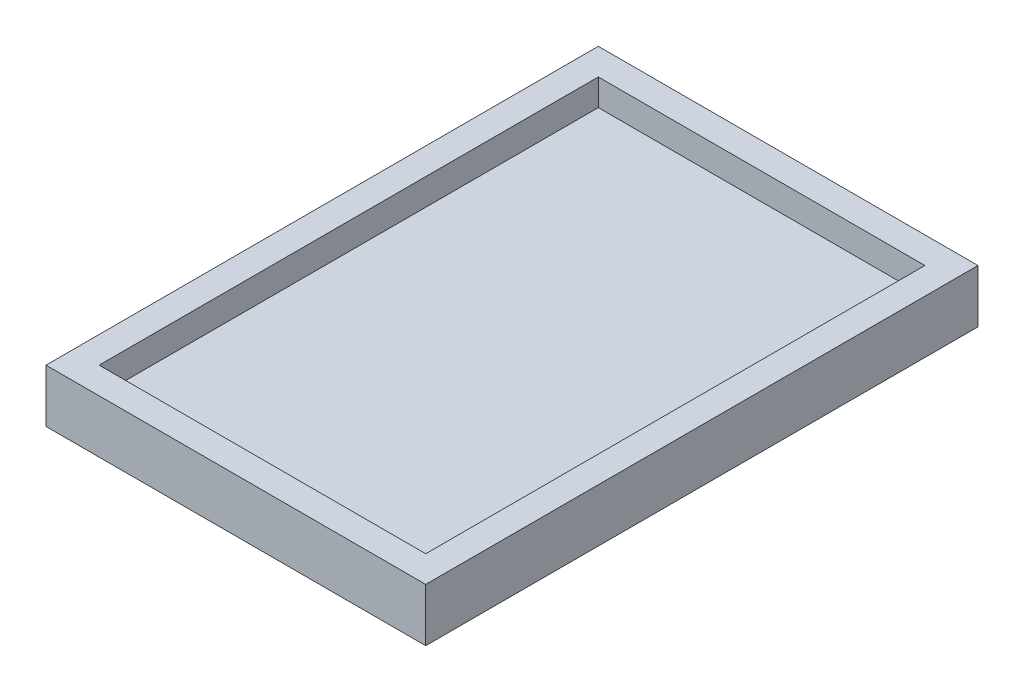
ISO-10303-21;
HEADER;
FILE_DESCRIPTION(('STEP AP214'),'2;1');
FILE_NAME('part.step','',(''),(''),'','','');
FILE_SCHEMA(('AUTOMOTIVE_DESIGN { 1 0 10303 214 1 1 1 1 }'));
ENDSEC;
DATA;
#1=APPLICATION_CONTEXT('core data for automotive mechanical design processes');
#2=APPLICATION_PROTOCOL_DEFINITION('international standard','automotive_design',2000,#1);
#3=PRODUCT_CONTEXT('',#1,'mechanical');
#4=PRODUCT('Part','Part','',(#3));
#5=PRODUCT_RELATED_PRODUCT_CATEGORY('part','',(#4));
#6=PRODUCT_DEFINITION_FORMATION('','',#4);
#7=PRODUCT_DEFINITION_CONTEXT('part definition',#1,'design');
#8=PRODUCT_DEFINITION('design','',#6,#7);
#9=PRODUCT_DEFINITION_SHAPE('','',#8);
#10=(LENGTH_UNIT() NAMED_UNIT(*) SI_UNIT(.MILLI.,.METRE.));
#11=(NAMED_UNIT(*) PLANE_ANGLE_UNIT() SI_UNIT($,.RADIAN.));
#12=(NAMED_UNIT(*) SI_UNIT($,.STERADIAN.) SOLID_ANGLE_UNIT());
#13=UNCERTAINTY_MEASURE_WITH_UNIT(LENGTH_MEASURE(1.E-05),#10,'distance_accuracy_value','');
#14=(GEOMETRIC_REPRESENTATION_CONTEXT(3) GLOBAL_UNCERTAINTY_ASSIGNED_CONTEXT((#13)) GLOBAL_UNIT_ASSIGNED_CONTEXT((#10,
#11,#12)) REPRESENTATION_CONTEXT('',''));
#15=CARTESIAN_POINT('',(0.,0.,0.));
#16=DIRECTION('',(0.,0.,1.));
#17=DIRECTION('',(1.,0.,0.));
#18=AXIS2_PLACEMENT_3D('',#15,#16,#17);
#19=CARTESIAN_POINT('',(0.,10.,0.));
#20=DIRECTION('',(0.,-1.,0.));
#21=DIRECTION('',(0.,0.,-1.));
#22=AXIS2_PLACEMENT_3D('',#19,#20,#21);
#23=PLANE('',#22);
#24=DIRECTION('',(0.,0.,-1.));
#25=VECTOR('',#24,1.);
#26=CARTESIAN_POINT('',(71.5,10.,0.));
#27=LINE('',#26,#25);
#28=CARTESIAN_POINT('',(71.5,10.,104.));
#29=VERTEX_POINT('',#28);
#30=CARTESIAN_POINT('',(71.5,10.,-104.));
#31=VERTEX_POINT('',#30);
#32=EDGE_CURVE('E157',#29,#31,#27,.T.);
#33=ORIENTED_EDGE('',*,*,#32,.T.);
#34=DIRECTION('',(-1.,0.,0.));
#35=VECTOR('',#34,1.);
#36=CARTESIAN_POINT('',(0.,10.,-104.));
#37=LINE('',#36,#35);
#38=CARTESIAN_POINT('',(-71.5,10.,-104.));
#39=VERTEX_POINT('',#38);
#40=EDGE_CURVE('E159',#31,#39,#37,.T.);
#41=ORIENTED_EDGE('',*,*,#40,.T.);
#42=DIRECTION('',(0.,0.,1.));
#43=VECTOR('',#42,1.);
#44=CARTESIAN_POINT('',(-71.5,10.,0.));
#45=LINE('',#44,#43);
#46=CARTESIAN_POINT('',(-71.5,10.,104.));
#47=VERTEX_POINT('',#46);
#48=EDGE_CURVE('E160',#39,#47,#45,.T.);
#49=ORIENTED_EDGE('',*,*,#48,.T.);
#50=DIRECTION('',(1.,0.,0.));
#51=VECTOR('',#50,1.);
#52=CARTESIAN_POINT('',(0.,10.,104.));
#53=LINE('',#52,#51);
#54=EDGE_CURVE('E38',#47,#29,#53,.T.);
#55=ORIENTED_EDGE('',*,*,#54,.T.);
#56=EDGE_LOOP('',(#33,#41,#49,#55));
#57=FACE_BOUND('',#56,.T.);
#58=DIRECTION('',(0.,0.,-1.));
#59=VECTOR('',#58,1.);
#60=CARTESIAN_POINT('',(61.5,10.,94.));
#61=LINE('',#60,#59);
#62=CARTESIAN_POINT('',(61.5,10.,94.));
#63=VERTEX_POINT('',#62);
#64=CARTESIAN_POINT('',(61.5,10.,-94.));
#65=VERTEX_POINT('',#64);
#66=EDGE_CURVE('E103',#63,#65,#61,.T.);
#67=ORIENTED_EDGE('',*,*,#66,.F.);
#68=DIRECTION('',(1.,0.,0.));
#69=VECTOR('',#68,1.);
#70=CARTESIAN_POINT('',(-61.5,10.,94.));
#71=LINE('',#70,#69);
#72=CARTESIAN_POINT('',(-61.5,10.,94.));
#73=VERTEX_POINT('',#72);
#74=EDGE_CURVE('E128',#73,#63,#71,.T.);
#75=ORIENTED_EDGE('',*,*,#74,.F.);
#76=DIRECTION('',(0.,0.,1.));
#77=VECTOR('',#76,1.);
#78=CARTESIAN_POINT('',(-61.5,10.,94.));
#79=LINE('',#78,#77);
#80=CARTESIAN_POINT('',(-61.5,10.,-94.));
#81=VERTEX_POINT('',#80);
#82=EDGE_CURVE('E126',#81,#73,#79,.T.);
#83=ORIENTED_EDGE('',*,*,#82,.F.);
#84=DIRECTION('',(-1.,0.,0.));
#85=VECTOR('',#84,1.);
#86=CARTESIAN_POINT('',(-61.5,10.,-94.));
#87=LINE('',#86,#85);
#88=EDGE_CURVE('E114',#65,#81,#87,.T.);
#89=ORIENTED_EDGE('',*,*,#88,.F.);
#90=EDGE_LOOP('',(#67,#75,#83,#89));
#91=FACE_BOUND('',#90,.T.);
#92=ADVANCED_FACE('F34',(#57,#91),#23,.F.);
#93=CARTESIAN_POINT('',(71.5,10.,94.));
#94=DIRECTION('',(-1.,0.,0.));
#95=DIRECTION('',(0.,0.,1.));
#96=AXIS2_PLACEMENT_3D('',#93,#94,#95);
#97=PLANE('',#96);
#98=DIRECTION('',(0.,0.,-1.));
#99=VECTOR('',#98,1.);
#100=CARTESIAN_POINT('',(71.5,-10.,0.));
#101=LINE('',#100,#99);
#102=CARTESIAN_POINT('',(71.5,-10.,104.));
#103=VERTEX_POINT('',#102);
#104=CARTESIAN_POINT('',(71.5,-10.,-104.));
#105=VERTEX_POINT('',#104);
#106=EDGE_CURVE('E122',#103,#105,#101,.T.);
#107=ORIENTED_EDGE('',*,*,#106,.T.);
#108=DIRECTION('',(0.,-1.,0.));
#109=VECTOR('',#108,1.);
#110=CARTESIAN_POINT('',(71.5,10.,-104.));
#111=LINE('',#110,#109);
#112=EDGE_CURVE('E11',#31,#105,#111,.T.);
#113=ORIENTED_EDGE('',*,*,#112,.F.);
#114=ORIENTED_EDGE('',*,*,#32,.F.);
#115=DIRECTION('',(0.,-1.,0.));
#116=VECTOR('',#115,1.);
#117=CARTESIAN_POINT('',(71.5,10.,104.));
#118=LINE('',#117,#116);
#119=EDGE_CURVE('E144',#29,#103,#118,.T.);
#120=ORIENTED_EDGE('',*,*,#119,.T.);
#121=EDGE_LOOP('',(#107,#113,#114,#120));
#122=FACE_BOUND('',#121,.T.);
#123=ADVANCED_FACE('F174',(#122),#97,.F.);
#124=CARTESIAN_POINT('',(-61.5,10.,-104.));
#125=DIRECTION('',(0.,0.,1.));
#126=DIRECTION('',(1.,0.,0.));
#127=AXIS2_PLACEMENT_3D('',#124,#125,#126);
#128=PLANE('',#127);
#129=DIRECTION('',(-1.,0.,0.));
#130=VECTOR('',#129,1.);
#131=CARTESIAN_POINT('',(0.,-10.,-104.));
#132=LINE('',#131,#130);
#133=CARTESIAN_POINT('',(-71.5,-10.,-104.));
#134=VERTEX_POINT('',#133);
#135=EDGE_CURVE('E142',#105,#134,#132,.T.);
#136=ORIENTED_EDGE('',*,*,#135,.T.);
#137=DIRECTION('',(0.,-1.,0.));
#138=VECTOR('',#137,1.);
#139=CARTESIAN_POINT('',(-71.5,10.,-104.));
#140=LINE('',#139,#138);
#141=EDGE_CURVE('E43',#39,#134,#140,.T.);
#142=ORIENTED_EDGE('',*,*,#141,.F.);
#143=ORIENTED_EDGE('',*,*,#40,.F.);
#144=ORIENTED_EDGE('',*,*,#112,.T.);
#145=EDGE_LOOP('',(#136,#142,#143,#144));
#146=FACE_BOUND('',#145,.T.);
#147=ADVANCED_FACE('F176',(#146),#128,.F.);
#148=CARTESIAN_POINT('',(-71.5,10.,94.));
#149=DIRECTION('',(1.,0.,0.));
#150=DIRECTION('',(0.,0.,-1.));
#151=AXIS2_PLACEMENT_3D('',#148,#149,#150);
#152=PLANE('',#151);
#153=DIRECTION('',(0.,0.,1.));
#154=VECTOR('',#153,1.);
#155=CARTESIAN_POINT('',(-71.5,-10.,0.));
#156=LINE('',#155,#154);
#157=CARTESIAN_POINT('',(-71.5,-10.,104.));
#158=VERTEX_POINT('',#157);
#159=EDGE_CURVE('E149',#134,#158,#156,.T.);
#160=ORIENTED_EDGE('',*,*,#159,.T.);
#161=DIRECTION('',(0.,-1.,0.));
#162=VECTOR('',#161,1.);
#163=CARTESIAN_POINT('',(-71.5,10.,104.));
#164=LINE('',#163,#162);
#165=EDGE_CURVE('E147',#47,#158,#164,.T.);
#166=ORIENTED_EDGE('',*,*,#165,.F.);
#167=ORIENTED_EDGE('',*,*,#48,.F.);
#168=ORIENTED_EDGE('',*,*,#141,.T.);
#169=EDGE_LOOP('',(#160,#166,#167,#168));
#170=FACE_BOUND('',#169,.T.);
#171=ADVANCED_FACE('F165',(#170),#152,.F.);
#172=CARTESIAN_POINT('',(-61.5,10.,104.));
#173=DIRECTION('',(0.,0.,-1.));
#174=DIRECTION('',(-1.,0.,0.));
#175=AXIS2_PLACEMENT_3D('',#172,#173,#174);
#176=PLANE('',#175);
#177=DIRECTION('',(1.,0.,0.));
#178=VECTOR('',#177,1.);
#179=CARTESIAN_POINT('',(0.,-10.,104.));
#180=LINE('',#179,#178);
#181=EDGE_CURVE('E153',#158,#103,#180,.T.);
#182=ORIENTED_EDGE('',*,*,#181,.T.);
#183=ORIENTED_EDGE('',*,*,#119,.F.);
#184=ORIENTED_EDGE('',*,*,#54,.F.);
#185=ORIENTED_EDGE('',*,*,#165,.T.);
#186=EDGE_LOOP('',(#182,#183,#184,#185));
#187=FACE_BOUND('',#186,.T.);
#188=ADVANCED_FACE('F169',(#187),#176,.F.);
#189=CARTESIAN_POINT('',(0.,-10.,0.));
#190=DIRECTION('',(0.,-1.,0.));
#191=DIRECTION('',(0.,0.,-1.));
#192=AXIS2_PLACEMENT_3D('',#189,#190,#191);
#193=PLANE('',#192);
#194=ORIENTED_EDGE('',*,*,#106,.F.);
#195=ORIENTED_EDGE('',*,*,#181,.F.);
#196=ORIENTED_EDGE('',*,*,#159,.F.);
#197=ORIENTED_EDGE('',*,*,#135,.F.);
#198=EDGE_LOOP('',(#194,#195,#196,#197));
#199=FACE_BOUND('',#198,.T.);
#200=ADVANCED_FACE('F36',(#199),#193,.T.);
#201=CARTESIAN_POINT('',(61.5,10.,94.));
#202=DIRECTION('',(-1.,0.,0.));
#203=DIRECTION('',(0.,0.,1.));
#204=AXIS2_PLACEMENT_3D('',#201,#202,#203);
#205=PLANE('',#204);
#206=DIRECTION('',(0.,0.,-1.));
#207=VECTOR('',#206,1.);
#208=CARTESIAN_POINT('',(61.5,0.,94.));
#209=LINE('',#208,#207);
#210=CARTESIAN_POINT('',(61.5,0.,94.));
#211=VERTEX_POINT('',#210);
#212=CARTESIAN_POINT('',(61.5,0.,-94.));
#213=VERTEX_POINT('',#212);
#214=EDGE_CURVE('E132',#211,#213,#209,.T.);
#215=ORIENTED_EDGE('',*,*,#214,.F.);
#216=DIRECTION('',(0.,-1.,0.));
#217=VECTOR('',#216,1.);
#218=CARTESIAN_POINT('',(61.5,10.,94.));
#219=LINE('',#218,#217);
#220=EDGE_CURVE('E110',#63,#211,#219,.T.);
#221=ORIENTED_EDGE('',*,*,#220,.F.);
#222=ORIENTED_EDGE('',*,*,#66,.T.);
#223=DIRECTION('',(0.,-1.,0.));
#224=VECTOR('',#223,1.);
#225=CARTESIAN_POINT('',(61.5,10.,-94.));
#226=LINE('',#225,#224);
#227=EDGE_CURVE('E107',#65,#213,#226,.T.);
#228=ORIENTED_EDGE('',*,*,#227,.T.);
#229=EDGE_LOOP('',(#215,#221,#222,#228));
#230=FACE_BOUND('',#229,.T.);
#231=ADVANCED_FACE('F106',(#230),#205,.T.);
#232=CARTESIAN_POINT('',(-61.5,10.,-94.));
#233=DIRECTION('',(0.,0.,1.));
#234=DIRECTION('',(1.,0.,0.));
#235=AXIS2_PLACEMENT_3D('',#232,#233,#234);
#236=PLANE('',#235);
#237=DIRECTION('',(-1.,0.,0.));
#238=VECTOR('',#237,1.);
#239=CARTESIAN_POINT('',(-61.5,0.,-94.));
#240=LINE('',#239,#238);
#241=CARTESIAN_POINT('',(-61.5,0.,-94.));
#242=VERTEX_POINT('',#241);
#243=EDGE_CURVE('E121',#213,#242,#240,.T.);
#244=ORIENTED_EDGE('',*,*,#243,.F.);
#245=ORIENTED_EDGE('',*,*,#227,.F.);
#246=ORIENTED_EDGE('',*,*,#88,.T.);
#247=DIRECTION('',(0.,-1.,0.));
#248=VECTOR('',#247,1.);
#249=CARTESIAN_POINT('',(-61.5,10.,-94.));
#250=LINE('',#249,#248);
#251=EDGE_CURVE('E123',#81,#242,#250,.T.);
#252=ORIENTED_EDGE('',*,*,#251,.T.);
#253=EDGE_LOOP('',(#244,#245,#246,#252));
#254=FACE_BOUND('',#253,.T.);
#255=ADVANCED_FACE('F118',(#254),#236,.T.);
#256=CARTESIAN_POINT('',(-61.5,10.,94.));
#257=DIRECTION('',(1.,0.,0.));
#258=DIRECTION('',(0.,0.,-1.));
#259=AXIS2_PLACEMENT_3D('',#256,#257,#258);
#260=PLANE('',#259);
#261=DIRECTION('',(0.,0.,1.));
#262=VECTOR('',#261,1.);
#263=CARTESIAN_POINT('',(-61.5,0.,94.));
#264=LINE('',#263,#262);
#265=CARTESIAN_POINT('',(-61.5,0.,94.));
#266=VERTEX_POINT('',#265);
#267=EDGE_CURVE('E135',#242,#266,#264,.T.);
#268=ORIENTED_EDGE('',*,*,#267,.F.);
#269=ORIENTED_EDGE('',*,*,#251,.F.);
#270=ORIENTED_EDGE('',*,*,#82,.T.);
#271=DIRECTION('',(0.,-1.,0.));
#272=VECTOR('',#271,1.);
#273=CARTESIAN_POINT('',(-61.5,10.,94.));
#274=LINE('',#273,#272);
#275=EDGE_CURVE('E51',#73,#266,#274,.T.);
#276=ORIENTED_EDGE('',*,*,#275,.T.);
#277=EDGE_LOOP('',(#268,#269,#270,#276));
#278=FACE_BOUND('',#277,.T.);
#279=ADVANCED_FACE('F223',(#278),#260,.T.);
#280=CARTESIAN_POINT('',(-61.5,10.,94.));
#281=DIRECTION('',(0.,0.,-1.));
#282=DIRECTION('',(-1.,0.,0.));
#283=AXIS2_PLACEMENT_3D('',#280,#281,#282);
#284=PLANE('',#283);
#285=DIRECTION('',(1.,0.,0.));
#286=VECTOR('',#285,1.);
#287=CARTESIAN_POINT('',(-61.5,0.,94.));
#288=LINE('',#287,#286);
#289=EDGE_CURVE('E115',#266,#211,#288,.T.);
#290=ORIENTED_EDGE('',*,*,#289,.F.);
#291=ORIENTED_EDGE('',*,*,#275,.F.);
#292=ORIENTED_EDGE('',*,*,#74,.T.);
#293=ORIENTED_EDGE('',*,*,#220,.T.);
#294=EDGE_LOOP('',(#290,#291,#292,#293));
#295=FACE_BOUND('',#294,.T.);
#296=ADVANCED_FACE('F231',(#295),#284,.T.);
#297=CARTESIAN_POINT('',(0.,0.,0.));
#298=DIRECTION('',(0.,-1.,0.));
#299=DIRECTION('',(0.,0.,-1.));
#300=AXIS2_PLACEMENT_3D('',#297,#298,#299);
#301=PLANE('',#300);
#302=ORIENTED_EDGE('',*,*,#214,.T.);
#303=ORIENTED_EDGE('',*,*,#243,.T.);
#304=ORIENTED_EDGE('',*,*,#267,.T.);
#305=ORIENTED_EDGE('',*,*,#289,.T.);
#306=EDGE_LOOP('',(#302,#303,#304,#305));
#307=FACE_BOUND('',#306,.T.);
#308=ADVANCED_FACE('F241',(#307),#301,.F.);
#309=CLOSED_SHELL('',(#92,#123,#147,#171,#188,#200,#231,#255,#279,#296,#308));
#310=MANIFOLD_SOLID_BREP('B2',#309);
#311=ADVANCED_BREP_SHAPE_REPRESENTATION('',(#18,#310),#14);
#312=SHAPE_DEFINITION_REPRESENTATION(#9,#311);
ENDSEC;
END-ISO-10303-21;
